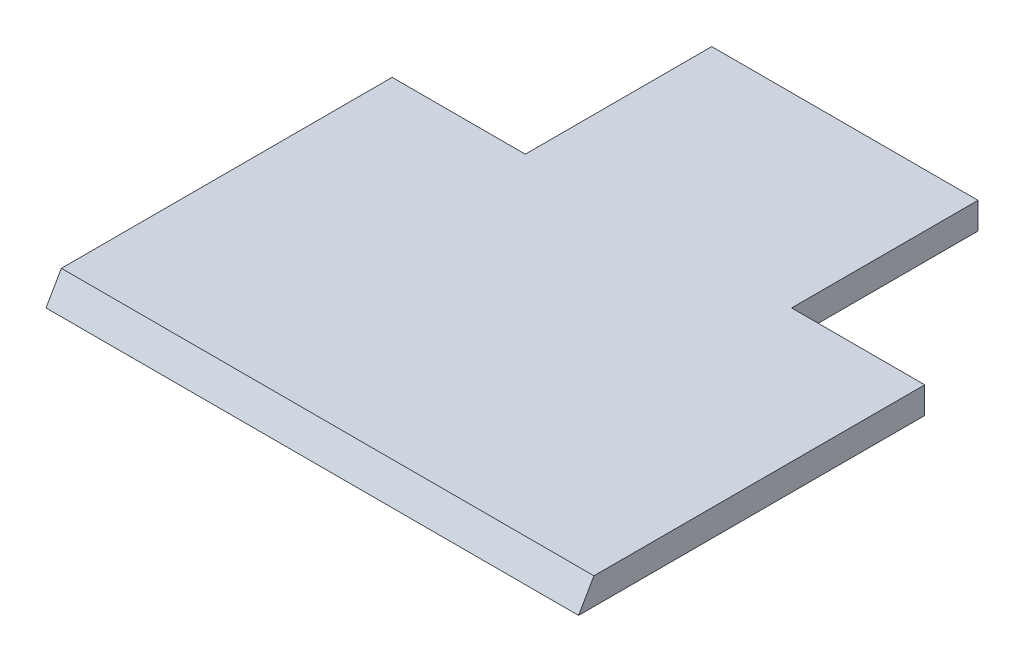
ISO-10303-21;
HEADER;
FILE_DESCRIPTION(('STEP AP214'),'2;1');
FILE_NAME('part.step','',(''),(''),'','','');
FILE_SCHEMA(('AUTOMOTIVE_DESIGN { 1 0 10303 214 1 1 1 1 }'));
ENDSEC;
DATA;
#1=APPLICATION_CONTEXT('core data for automotive mechanical design processes');
#2=APPLICATION_PROTOCOL_DEFINITION('international standard','automotive_design',2000,#1);
#3=PRODUCT_CONTEXT('',#1,'mechanical');
#4=PRODUCT('Part','Part','',(#3));
#5=PRODUCT_RELATED_PRODUCT_CATEGORY('part','',(#4));
#6=PRODUCT_DEFINITION_FORMATION('','',#4);
#7=PRODUCT_DEFINITION_CONTEXT('part definition',#1,'design');
#8=PRODUCT_DEFINITION('design','',#6,#7);
#9=PRODUCT_DEFINITION_SHAPE('','',#8);
#10=(LENGTH_UNIT() NAMED_UNIT(*) SI_UNIT(.MILLI.,.METRE.));
#11=(NAMED_UNIT(*) PLANE_ANGLE_UNIT() SI_UNIT($,.RADIAN.));
#12=(NAMED_UNIT(*) SI_UNIT($,.STERADIAN.) SOLID_ANGLE_UNIT());
#13=UNCERTAINTY_MEASURE_WITH_UNIT(LENGTH_MEASURE(1.E-05),#10,'distance_accuracy_value','');
#14=(GEOMETRIC_REPRESENTATION_CONTEXT(3) GLOBAL_UNCERTAINTY_ASSIGNED_CONTEXT((#13)) GLOBAL_UNIT_ASSIGNED_CONTEXT((#10,
#11,#12)) REPRESENTATION_CONTEXT('',''));
#15=CARTESIAN_POINT('',(0.,0.,0.));
#16=DIRECTION('',(0.,0.,1.));
#17=DIRECTION('',(1.,0.,0.));
#18=AXIS2_PLACEMENT_3D('',#15,#16,#17);
#19=CARTESIAN_POINT('',(50.,5.,50.));
#20=DIRECTION('',(-1.,0.,0.));
#21=DIRECTION('',(0.,0.,1.));
#22=AXIS2_PLACEMENT_3D('',#19,#20,#21);
#23=PLANE('',#22);
#24=DIRECTION('',(0.,0.,-1.));
#25=VECTOR('',#24,1.);
#26=CARTESIAN_POINT('',(50.,0.,50.));
#27=LINE('',#26,#25);
#28=CARTESIAN_POINT('',(50.,0.,50.));
#29=VERTEX_POINT('',#28);
#30=CARTESIAN_POINT('',(50.,0.,-15.));
#31=VERTEX_POINT('',#30);
#32=EDGE_CURVE('E115',#29,#31,#27,.T.);
#33=ORIENTED_EDGE('',*,*,#32,.T.);
#34=DIRECTION('',(0.,1.,0.));
#35=VECTOR('',#34,1.);
#36=CARTESIAN_POINT('',(50.,-0.00100000000000013,-15.));
#37=LINE('',#36,#35);
#38=CARTESIAN_POINT('',(50.,5.,-15.));
#39=VERTEX_POINT('',#38);
#40=EDGE_CURVE('E178',#31,#39,#37,.T.);
#41=ORIENTED_EDGE('',*,*,#40,.T.);
#42=DIRECTION('',(0.,0.,-1.));
#43=VECTOR('',#42,1.);
#44=CARTESIAN_POINT('',(50.,5.,50.));
#45=LINE('',#44,#43);
#46=CARTESIAN_POINT('',(50.,5.,47.1132486540519));
#47=VERTEX_POINT('',#46);
#48=EDGE_CURVE('E137',#47,#39,#45,.T.);
#49=ORIENTED_EDGE('',*,*,#48,.F.);
#50=DIRECTION('',(0.,0.86602540378444,-0.499999999999998));
#51=VECTOR('',#50,1.);
#52=CARTESIAN_POINT('',(50.,5.,47.1132486540519));
#53=LINE('',#52,#51);
#54=EDGE_CURVE('E51',#47,#29,#53,.F.);
#55=ORIENTED_EDGE('',*,*,#54,.T.);
#56=EDGE_LOOP('',(#33,#41,#49,#55));
#57=FACE_BOUND('',#56,.T.);
#58=ADVANCED_FACE('F41',(#57),#23,.F.);
#59=CARTESIAN_POINT('',(-50.,5.,-50.));
#60=DIRECTION('',(0.,0.,1.));
#61=DIRECTION('',(1.,0.,0.));
#62=AXIS2_PLACEMENT_3D('',#59,#60,#61);
#63=PLANE('',#62);
#64=DIRECTION('',(-1.,0.,0.));
#65=VECTOR('',#64,1.);
#66=CARTESIAN_POINT('',(-50.,0.,-50.));
#67=LINE('',#66,#65);
#68=CARTESIAN_POINT('',(25.,0.,-50.));
#69=VERTEX_POINT('',#68);
#70=CARTESIAN_POINT('',(-25.,0.,-50.));
#71=VERTEX_POINT('',#70);
#72=EDGE_CURVE('E133',#69,#71,#67,.T.);
#73=ORIENTED_EDGE('',*,*,#72,.T.);
#74=DIRECTION('',(0.,1.,0.));
#75=VECTOR('',#74,1.);
#76=CARTESIAN_POINT('',(-25.,-0.00100000000000013,-50.));
#77=LINE('',#76,#75);
#78=CARTESIAN_POINT('',(-25.,5.,-50.));
#79=VERTEX_POINT('',#78);
#80=EDGE_CURVE('E116',#71,#79,#77,.T.);
#81=ORIENTED_EDGE('',*,*,#80,.T.);
#82=DIRECTION('',(-1.,0.,0.));
#83=VECTOR('',#82,1.);
#84=CARTESIAN_POINT('',(-50.,5.,-50.));
#85=LINE('',#84,#83);
#86=CARTESIAN_POINT('',(25.,5.,-50.));
#87=VERTEX_POINT('',#86);
#88=EDGE_CURVE('E165',#87,#79,#85,.T.);
#89=ORIENTED_EDGE('',*,*,#88,.F.);
#90=DIRECTION('',(0.,1.,0.));
#91=VECTOR('',#90,1.);
#92=CARTESIAN_POINT('',(25.,-0.00100000000000013,-50.));
#93=LINE('',#92,#91);
#94=EDGE_CURVE('E172',#69,#87,#93,.T.);
#95=ORIENTED_EDGE('',*,*,#94,.F.);
#96=EDGE_LOOP('',(#73,#81,#89,#95));
#97=FACE_BOUND('',#96,.T.);
#98=ADVANCED_FACE('F206',(#97),#63,.F.);
#99=CARTESIAN_POINT('',(-50.,5.,50.));
#100=DIRECTION('',(1.,0.,0.));
#101=DIRECTION('',(0.,0.,-1.));
#102=AXIS2_PLACEMENT_3D('',#99,#100,#101);
#103=PLANE('',#102);
#104=DIRECTION('',(0.,0.,1.));
#105=VECTOR('',#104,1.);
#106=CARTESIAN_POINT('',(-50.,5.,50.));
#107=LINE('',#106,#105);
#108=CARTESIAN_POINT('',(-50.,5.,-15.));
#109=VERTEX_POINT('',#108);
#110=CARTESIAN_POINT('',(-50.,5.,47.1132486540519));
#111=VERTEX_POINT('',#110);
#112=EDGE_CURVE('E123',#109,#111,#107,.T.);
#113=ORIENTED_EDGE('',*,*,#112,.F.);
#114=DIRECTION('',(0.,1.,0.));
#115=VECTOR('',#114,1.);
#116=CARTESIAN_POINT('',(-50.,-0.00100000000000013,-15.));
#117=LINE('',#116,#115);
#118=CARTESIAN_POINT('',(-50.,0.,-15.));
#119=VERTEX_POINT('',#118);
#120=EDGE_CURVE('E109',#119,#109,#117,.T.);
#121=ORIENTED_EDGE('',*,*,#120,.F.);
#122=DIRECTION('',(0.,0.,1.));
#123=VECTOR('',#122,1.);
#124=CARTESIAN_POINT('',(-50.,0.,50.));
#125=LINE('',#124,#123);
#126=CARTESIAN_POINT('',(-50.,0.,50.));
#127=VERTEX_POINT('',#126);
#128=EDGE_CURVE('E121',#119,#127,#125,.T.);
#129=ORIENTED_EDGE('',*,*,#128,.T.);
#130=DIRECTION('',(0.,-0.86602540378444,0.499999999999998));
#131=VECTOR('',#130,1.);
#132=CARTESIAN_POINT('',(-50.,5.,47.1132486540519));
#133=LINE('',#132,#131);
#134=EDGE_CURVE('E11',#127,#111,#133,.F.);
#135=ORIENTED_EDGE('',*,*,#134,.T.);
#136=EDGE_LOOP('',(#113,#121,#129,#135));
#137=FACE_BOUND('',#136,.T.);
#138=ADVANCED_FACE('F120',(#137),#103,.F.);
#139=CARTESIAN_POINT('',(0.,5.,0.));
#140=DIRECTION('',(0.,-1.,0.));
#141=DIRECTION('',(0.,0.,-1.));
#142=AXIS2_PLACEMENT_3D('',#139,#140,#141);
#143=PLANE('',#142);
#144=ORIENTED_EDGE('',*,*,#88,.T.);
#145=DIRECTION('',(0.,0.,-1.));
#146=VECTOR('',#145,1.);
#147=CARTESIAN_POINT('',(-25.,5.,-50.));
#148=LINE('',#147,#146);
#149=CARTESIAN_POINT('',(-25.,5.,-15.));
#150=VERTEX_POINT('',#149);
#151=EDGE_CURVE('E125',#150,#79,#148,.T.);
#152=ORIENTED_EDGE('',*,*,#151,.F.);
#153=DIRECTION('',(1.,0.,0.));
#154=VECTOR('',#153,1.);
#155=CARTESIAN_POINT('',(-50.,5.,-15.));
#156=LINE('',#155,#154);
#157=EDGE_CURVE('E163',#109,#150,#156,.T.);
#158=ORIENTED_EDGE('',*,*,#157,.F.);
#159=ORIENTED_EDGE('',*,*,#112,.T.);
#160=DIRECTION('',(1.,0.,0.));
#161=VECTOR('',#160,1.);
#162=CARTESIAN_POINT('',(0.,5.,47.1132486540519));
#163=LINE('',#162,#161);
#164=EDGE_CURVE('E143',#111,#47,#163,.T.);
#165=ORIENTED_EDGE('',*,*,#164,.T.);
#166=ORIENTED_EDGE('',*,*,#48,.T.);
#167=DIRECTION('',(1.,0.,0.));
#168=VECTOR('',#167,1.);
#169=CARTESIAN_POINT('',(50.,5.,-15.));
#170=LINE('',#169,#168);
#171=CARTESIAN_POINT('',(25.,5.,-15.));
#172=VERTEX_POINT('',#171);
#173=EDGE_CURVE('E175',#172,#39,#170,.T.);
#174=ORIENTED_EDGE('',*,*,#173,.F.);
#175=DIRECTION('',(0.,0.,1.));
#176=VECTOR('',#175,1.);
#177=CARTESIAN_POINT('',(25.,5.,-50.));
#178=LINE('',#177,#176);
#179=EDGE_CURVE('E184',#87,#172,#178,.T.);
#180=ORIENTED_EDGE('',*,*,#179,.F.);
#181=EDGE_LOOP('',(#144,#152,#158,#159,#165,#166,#174,#180));
#182=FACE_BOUND('',#181,.T.);
#183=ADVANCED_FACE('F160',(#182),#143,.F.);
#184=CARTESIAN_POINT('',(0.,0.,0.));
#185=DIRECTION('',(0.,-1.,0.));
#186=DIRECTION('',(0.,0.,-1.));
#187=AXIS2_PLACEMENT_3D('',#184,#185,#186);
#188=PLANE('',#187);
#189=DIRECTION('',(0.,0.,-1.));
#190=VECTOR('',#189,1.);
#191=CARTESIAN_POINT('',(-25.,0.,-50.));
#192=LINE('',#191,#190);
#193=CARTESIAN_POINT('',(-25.,0.,-15.));
#194=VERTEX_POINT('',#193);
#195=EDGE_CURVE('E181',#194,#71,#192,.T.);
#196=ORIENTED_EDGE('',*,*,#195,.T.);
#197=ORIENTED_EDGE('',*,*,#72,.F.);
#198=DIRECTION('',(0.,0.,1.));
#199=VECTOR('',#198,1.);
#200=CARTESIAN_POINT('',(25.,0.,-50.));
#201=LINE('',#200,#199);
#202=CARTESIAN_POINT('',(25.,0.,-15.));
#203=VERTEX_POINT('',#202);
#204=EDGE_CURVE('E189',#69,#203,#201,.T.);
#205=ORIENTED_EDGE('',*,*,#204,.T.);
#206=DIRECTION('',(1.,0.,0.));
#207=VECTOR('',#206,1.);
#208=CARTESIAN_POINT('',(50.,0.,-15.));
#209=LINE('',#208,#207);
#210=EDGE_CURVE('E156',#203,#31,#209,.T.);
#211=ORIENTED_EDGE('',*,*,#210,.T.);
#212=ORIENTED_EDGE('',*,*,#32,.F.);
#213=DIRECTION('',(1.,0.,0.));
#214=VECTOR('',#213,1.);
#215=CARTESIAN_POINT('',(-50.,0.,50.));
#216=LINE('',#215,#214);
#217=EDGE_CURVE('E130',#127,#29,#216,.T.);
#218=ORIENTED_EDGE('',*,*,#217,.F.);
#219=ORIENTED_EDGE('',*,*,#128,.F.);
#220=DIRECTION('',(1.,0.,0.));
#221=VECTOR('',#220,1.);
#222=CARTESIAN_POINT('',(-50.,0.,-15.));
#223=LINE('',#222,#221);
#224=EDGE_CURVE('E106',#119,#194,#223,.T.);
#225=ORIENTED_EDGE('',*,*,#224,.T.);
#226=EDGE_LOOP('',(#196,#197,#205,#211,#212,#218,#219,#225));
#227=FACE_BOUND('',#226,.T.);
#228=ADVANCED_FACE('F127',(#227),#188,.T.);
#229=CARTESIAN_POINT('',(0.,5.,47.1132486540519));
#230=DIRECTION('',(0.,-0.499999999999998,-0.86602540378444));
#231=DIRECTION('',(1.,0.,0.));
#232=AXIS2_PLACEMENT_3D('',#229,#230,#231);
#233=PLANE('',#232);
#234=ORIENTED_EDGE('',*,*,#134,.F.);
#235=ORIENTED_EDGE('',*,*,#217,.T.);
#236=ORIENTED_EDGE('',*,*,#54,.F.);
#237=ORIENTED_EDGE('',*,*,#164,.F.);
#238=EDGE_LOOP('',(#234,#235,#236,#237));
#239=FACE_BOUND('',#238,.T.);
#240=ADVANCED_FACE('F44',(#239),#233,.F.);
#241=CARTESIAN_POINT('',(50.,-0.00100000000000013,-15.));
#242=DIRECTION('',(0.,0.,1.));
#243=DIRECTION('',(1.,0.,0.));
#244=AXIS2_PLACEMENT_3D('',#241,#242,#243);
#245=PLANE('',#244);
#246=DIRECTION('',(0.,1.,0.));
#247=VECTOR('',#246,1.);
#248=CARTESIAN_POINT('',(25.,-0.00100000000000013,-15.));
#249=LINE('',#248,#247);
#250=EDGE_CURVE('E66',#203,#172,#249,.T.);
#251=ORIENTED_EDGE('',*,*,#250,.T.);
#252=ORIENTED_EDGE('',*,*,#173,.T.);
#253=ORIENTED_EDGE('',*,*,#40,.F.);
#254=ORIENTED_EDGE('',*,*,#210,.F.);
#255=EDGE_LOOP('',(#251,#252,#253,#254));
#256=FACE_BOUND('',#255,.T.);
#257=ADVANCED_FACE('F211',(#256),#245,.F.);
#258=CARTESIAN_POINT('',(25.,-0.00100000000000013,-50.));
#259=DIRECTION('',(-1.,0.,0.));
#260=DIRECTION('',(0.,0.,1.));
#261=AXIS2_PLACEMENT_3D('',#258,#259,#260);
#262=PLANE('',#261);
#263=ORIENTED_EDGE('',*,*,#94,.T.);
#264=ORIENTED_EDGE('',*,*,#179,.T.);
#265=ORIENTED_EDGE('',*,*,#250,.F.);
#266=ORIENTED_EDGE('',*,*,#204,.F.);
#267=EDGE_LOOP('',(#263,#264,#265,#266));
#268=FACE_BOUND('',#267,.T.);
#269=ADVANCED_FACE('F209',(#268),#262,.F.);
#270=CARTESIAN_POINT('',(-25.,-0.00100000000000013,-50.));
#271=DIRECTION('',(1.,0.,0.));
#272=DIRECTION('',(0.,0.,-1.));
#273=AXIS2_PLACEMENT_3D('',#270,#271,#272);
#274=PLANE('',#273);
#275=DIRECTION('',(0.,1.,0.));
#276=VECTOR('',#275,1.);
#277=CARTESIAN_POINT('',(-25.,-0.00100000000000013,-15.));
#278=LINE('',#277,#276);
#279=EDGE_CURVE('E58',#194,#150,#278,.T.);
#280=ORIENTED_EDGE('',*,*,#279,.T.);
#281=ORIENTED_EDGE('',*,*,#151,.T.);
#282=ORIENTED_EDGE('',*,*,#80,.F.);
#283=ORIENTED_EDGE('',*,*,#195,.F.);
#284=EDGE_LOOP('',(#280,#281,#282,#283));
#285=FACE_BOUND('',#284,.T.);
#286=ADVANCED_FACE('F218',(#285),#274,.F.);
#287=CARTESIAN_POINT('',(-50.,-0.00100000000000013,-15.));
#288=DIRECTION('',(0.,0.,1.));
#289=DIRECTION('',(1.,0.,0.));
#290=AXIS2_PLACEMENT_3D('',#287,#288,#289);
#291=PLANE('',#290);
#292=ORIENTED_EDGE('',*,*,#120,.T.);
#293=ORIENTED_EDGE('',*,*,#157,.T.);
#294=ORIENTED_EDGE('',*,*,#279,.F.);
#295=ORIENTED_EDGE('',*,*,#224,.F.);
#296=EDGE_LOOP('',(#292,#293,#294,#295));
#297=FACE_BOUND('',#296,.T.);
#298=ADVANCED_FACE('F108',(#297),#291,.F.);
#299=CLOSED_SHELL('',(#58,#98,#138,#183,#228,#240,#257,#269,#286,#298));
#300=MANIFOLD_SOLID_BREP('B2',#299);
#301=ADVANCED_BREP_SHAPE_REPRESENTATION('',(#18,#300),#14);
#302=SHAPE_DEFINITION_REPRESENTATION(#9,#301);
ENDSEC;
END-ISO-10303-21;
